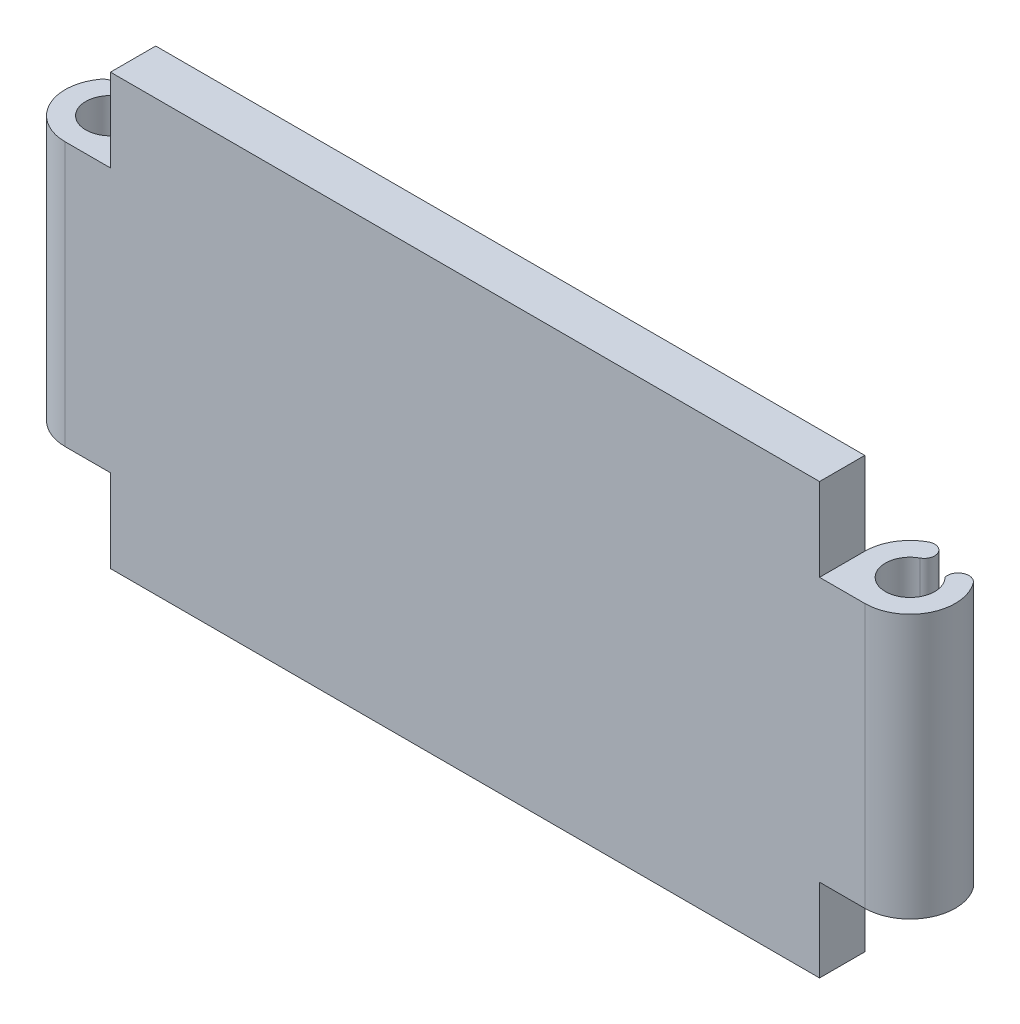
ISO-10303-21;
HEADER;
FILE_DESCRIPTION(('STEP AP214'),'2;1');
FILE_NAME('part.step','',(''),(''),'','','');
FILE_SCHEMA(('AUTOMOTIVE_DESIGN { 1 0 10303 214 1 1 1 1 }'));
ENDSEC;
DATA;
#1=APPLICATION_CONTEXT('core data for automotive mechanical design processes');
#2=APPLICATION_PROTOCOL_DEFINITION('international standard','automotive_design',2000,#1);
#3=PRODUCT_CONTEXT('',#1,'mechanical');
#4=PRODUCT('Part','Part','',(#3));
#5=PRODUCT_RELATED_PRODUCT_CATEGORY('part','',(#4));
#6=PRODUCT_DEFINITION_FORMATION('','',#4);
#7=PRODUCT_DEFINITION_CONTEXT('part definition',#1,'design');
#8=PRODUCT_DEFINITION('design','',#6,#7);
#9=PRODUCT_DEFINITION_SHAPE('','',#8);
#10=(LENGTH_UNIT() NAMED_UNIT(*) SI_UNIT(.MILLI.,.METRE.));
#11=(NAMED_UNIT(*) PLANE_ANGLE_UNIT() SI_UNIT($,.RADIAN.));
#12=(NAMED_UNIT(*) SI_UNIT($,.STERADIAN.) SOLID_ANGLE_UNIT());
#13=UNCERTAINTY_MEASURE_WITH_UNIT(LENGTH_MEASURE(1.E-05),#10,'distance_accuracy_value','');
#14=(GEOMETRIC_REPRESENTATION_CONTEXT(3) GLOBAL_UNCERTAINTY_ASSIGNED_CONTEXT((#13)) GLOBAL_UNIT_ASSIGNED_CONTEXT((#10,
#11,#12)) REPRESENTATION_CONTEXT('',''));
#15=CARTESIAN_POINT('',(0.,0.,0.));
#16=DIRECTION('',(0.,0.,1.));
#17=DIRECTION('',(1.,0.,0.));
#18=AXIS2_PLACEMENT_3D('',#15,#16,#17);
#19=CARTESIAN_POINT('',(-56.696642552174,57.,-2.67008988531399));
#20=DIRECTION('',(0.,-1.,0.));
#21=DIRECTION('',(0.,0.,-1.));
#22=AXIS2_PLACEMENT_3D('',#19,#20,#21);
#23=CYLINDRICAL_SURFACE('',#22,1.43989625620208);
#24=CARTESIAN_POINT('',(-56.696642552174,11.,-2.67008988531399));
#25=DIRECTION('',(0.,-1.,0.));
#26=DIRECTION('',(0.,0.,-1.));
#27=AXIS2_PLACEMENT_3D('',#24,#25,#26);
#28=CIRCLE('',#27,1.43989625620208);
#29=CARTESIAN_POINT('',(-57.8638927005138,11.,-3.51319623674638));
#30=VERTEX_POINT('',#29);
#31=CARTESIAN_POINT('',(-55.2962462943004,11.,-2.33513981506707));
#32=VERTEX_POINT('',#31);
#33=EDGE_CURVE('E257',#30,#32,#28,.T.);
#34=ORIENTED_EDGE('',*,*,#33,.F.);
#35=DIRECTION('',(0.,-1.,0.));
#36=VECTOR('',#35,1.);
#37=CARTESIAN_POINT('',(-57.8638927005138,57.,-3.51319623674638));
#38=LINE('',#37,#36);
#39=CARTESIAN_POINT('',(-57.8638927005138,46.,-3.51319623674638));
#40=VERTEX_POINT('',#39);
#41=EDGE_CURVE('E47',#40,#30,#38,.T.);
#42=ORIENTED_EDGE('',*,*,#41,.F.);
#43=CARTESIAN_POINT('',(-56.696642552174,46.,-2.67008988531399));
#44=DIRECTION('',(0.,1.,0.));
#45=DIRECTION('',(0.,0.,1.));
#46=AXIS2_PLACEMENT_3D('',#43,#44,#45);
#47=CIRCLE('',#46,1.43989625620208);
#48=CARTESIAN_POINT('',(-55.2962462943004,46.,-2.33513981506707));
#49=VERTEX_POINT('',#48);
#50=EDGE_CURVE('E255',#49,#40,#47,.T.);
#51=ORIENTED_EDGE('',*,*,#50,.F.);
#52=DIRECTION('',(0.,-1.,0.));
#53=VECTOR('',#52,1.);
#54=CARTESIAN_POINT('',(-55.2962462943004,57.,-2.33513981506707));
#55=LINE('',#54,#53);
#56=EDGE_CURVE('E258',#49,#32,#55,.T.);
#57=ORIENTED_EDGE('',*,*,#56,.T.);
#58=EDGE_LOOP('',(#34,#42,#51,#57));
#59=FACE_BOUND('',#58,.T.);
#60=ADVANCED_FACE('F39',(#59),#23,.T.);
#61=CARTESIAN_POINT('',(-53.,57.,0.));
#62=DIRECTION('',(0.,-1.,0.));
#63=DIRECTION('',(0.,0.,-1.));
#64=AXIS2_PLACEMENT_3D('',#61,#62,#63);
#65=CYLINDRICAL_SURFACE('',#64,6.);
#66=CARTESIAN_POINT('',(-53.,11.,0.));
#67=DIRECTION('',(0.,-1.,0.));
#68=DIRECTION('',(0.,0.,-1.));
#69=AXIS2_PLACEMENT_3D('',#66,#67,#68);
#70=CIRCLE('',#69,6.);
#71=CARTESIAN_POINT('',(-53.,11.,5.99999999999999));
#72=VERTEX_POINT('',#71);
#73=EDGE_CURVE('E177',#72,#30,#70,.T.);
#74=ORIENTED_EDGE('',*,*,#73,.F.);
#75=DIRECTION('',(0.,-1.,0.));
#76=VECTOR('',#75,1.);
#77=CARTESIAN_POINT('',(-53.,57.,6.));
#78=LINE('',#77,#76);
#79=CARTESIAN_POINT('',(-53.,46.,5.99999999999999));
#80=VERTEX_POINT('',#79);
#81=EDGE_CURVE('E239',#80,#72,#78,.T.);
#82=ORIENTED_EDGE('',*,*,#81,.F.);
#83=CARTESIAN_POINT('',(-53.,46.,0.));
#84=DIRECTION('',(0.,1.,0.));
#85=DIRECTION('',(0.,0.,1.));
#86=AXIS2_PLACEMENT_3D('',#83,#84,#85);
#87=CIRCLE('',#86,6.);
#88=EDGE_CURVE('E250',#40,#80,#87,.T.);
#89=ORIENTED_EDGE('',*,*,#88,.F.);
#90=ORIENTED_EDGE('',*,*,#41,.T.);
#91=EDGE_LOOP('',(#74,#82,#89,#90));
#92=FACE_BOUND('',#91,.T.);
#93=ADVANCED_FACE('F248',(#92),#65,.T.);
#94=CARTESIAN_POINT('',(53.,57.,0.));
#95=DIRECTION('',(0.,-1.,0.));
#96=DIRECTION('',(0.,0.,-1.));
#97=AXIS2_PLACEMENT_3D('',#94,#95,#96);
#98=CYLINDRICAL_SURFACE('',#97,6.);
#99=CARTESIAN_POINT('',(53.,11.,0.));
#100=DIRECTION('',(0.,-1.,0.));
#101=DIRECTION('',(0.,0.,-1.));
#102=AXIS2_PLACEMENT_3D('',#99,#100,#101);
#103=CIRCLE('',#102,6.);
#104=CARTESIAN_POINT('',(57.8638927005138,11.,-3.51319623674639));
#105=VERTEX_POINT('',#104);
#106=CARTESIAN_POINT('',(53.,11.,5.99999999999999));
#107=VERTEX_POINT('',#106);
#108=EDGE_CURVE('E367',#105,#107,#103,.T.);
#109=ORIENTED_EDGE('',*,*,#108,.F.);
#110=DIRECTION('',(0.,-1.,0.));
#111=VECTOR('',#110,1.);
#112=CARTESIAN_POINT('',(57.8638927005138,57.,-3.5131962367464));
#113=LINE('',#112,#111);
#114=CARTESIAN_POINT('',(57.8638927005138,46.,-3.51319623674639));
#115=VERTEX_POINT('',#114);
#116=EDGE_CURVE('E231',#115,#105,#113,.T.);
#117=ORIENTED_EDGE('',*,*,#116,.F.);
#118=CARTESIAN_POINT('',(53.,46.,0.));
#119=DIRECTION('',(0.,1.,0.));
#120=DIRECTION('',(0.,0.,1.));
#121=AXIS2_PLACEMENT_3D('',#118,#119,#120);
#122=CIRCLE('',#121,6.);
#123=CARTESIAN_POINT('',(53.,46.,5.99999999999999));
#124=VERTEX_POINT('',#123);
#125=EDGE_CURVE('E287',#124,#115,#122,.T.);
#126=ORIENTED_EDGE('',*,*,#125,.F.);
#127=DIRECTION('',(0.,-1.,0.));
#128=VECTOR('',#127,1.);
#129=CARTESIAN_POINT('',(53.,57.,5.99999999999999));
#130=LINE('',#129,#128);
#131=EDGE_CURVE('E235',#124,#107,#130,.T.);
#132=ORIENTED_EDGE('',*,*,#131,.T.);
#133=EDGE_LOOP('',(#109,#117,#126,#132));
#134=FACE_BOUND('',#133,.T.);
#135=ADVANCED_FACE('F410',(#134),#98,.T.);
#136=CARTESIAN_POINT('',(56.696642552174,57.,-2.670089885314));
#137=DIRECTION('',(0.,-1.,0.));
#138=DIRECTION('',(0.,0.,-1.));
#139=AXIS2_PLACEMENT_3D('',#136,#137,#138);
#140=CYLINDRICAL_SURFACE('',#139,1.43989625620208);
#141=CARTESIAN_POINT('',(56.696642552174,11.,-2.670089885314));
#142=DIRECTION('',(0.,-1.,0.));
#143=DIRECTION('',(0.,0.,-1.));
#144=AXIS2_PLACEMENT_3D('',#141,#142,#143);
#145=CIRCLE('',#144,1.43989625620208);
#146=CARTESIAN_POINT('',(55.2962462943004,11.,-2.33513981506708));
#147=VERTEX_POINT('',#146);
#148=EDGE_CURVE('E391',#147,#105,#145,.T.);
#149=ORIENTED_EDGE('',*,*,#148,.F.);
#150=DIRECTION('',(0.,-1.,0.));
#151=VECTOR('',#150,1.);
#152=CARTESIAN_POINT('',(55.2962462943004,57.,-2.33513981506708));
#153=LINE('',#152,#151);
#154=CARTESIAN_POINT('',(55.2962462943004,46.,-2.33513981506708));
#155=VERTEX_POINT('',#154);
#156=EDGE_CURVE('E227',#155,#147,#153,.T.);
#157=ORIENTED_EDGE('',*,*,#156,.F.);
#158=CARTESIAN_POINT('',(56.696642552174,46.,-2.670089885314));
#159=DIRECTION('',(0.,1.,0.));
#160=DIRECTION('',(0.,0.,1.));
#161=AXIS2_PLACEMENT_3D('',#158,#159,#160);
#162=CIRCLE('',#161,1.43989625620208);
#163=EDGE_CURVE('E310',#115,#155,#162,.T.);
#164=ORIENTED_EDGE('',*,*,#163,.F.);
#165=ORIENTED_EDGE('',*,*,#116,.T.);
#166=EDGE_LOOP('',(#149,#157,#164,#165));
#167=FACE_BOUND('',#166,.T.);
#168=ADVANCED_FACE('F418',(#167),#140,.T.);
#169=CARTESIAN_POINT('',(53.,57.,0.));
#170=DIRECTION('',(0.,-1.,0.));
#171=DIRECTION('',(0.,0.,-1.));
#172=AXIS2_PLACEMENT_3D('',#169,#170,#171);
#173=CYLINDRICAL_SURFACE('',#172,3.275);
#174=CARTESIAN_POINT('',(53.,11.,0.));
#175=DIRECTION('',(0.,-1.,0.));
#176=DIRECTION('',(0.,0.,-1.));
#177=AXIS2_PLACEMENT_3D('',#174,#175,#176);
#178=CIRCLE('',#177,3.275);
#179=CARTESIAN_POINT('',(51.4495535986174,11.,-2.88474278861042));
#180=VERTEX_POINT('',#179);
#181=EDGE_CURVE('E388',#180,#147,#178,.F.);
#182=ORIENTED_EDGE('',*,*,#181,.F.);
#183=DIRECTION('',(0.,-1.,0.));
#184=VECTOR('',#183,1.);
#185=CARTESIAN_POINT('',(51.4495535986174,57.,-2.88474278861042));
#186=LINE('',#185,#184);
#187=CARTESIAN_POINT('',(51.4495535986174,46.,-2.88474278861042));
#188=VERTEX_POINT('',#187);
#189=EDGE_CURVE('E223',#188,#180,#186,.T.);
#190=ORIENTED_EDGE('',*,*,#189,.F.);
#191=CARTESIAN_POINT('',(53.,46.,0.));
#192=DIRECTION('',(0.,1.,0.));
#193=DIRECTION('',(0.,0.,1.));
#194=AXIS2_PLACEMENT_3D('',#191,#192,#193);
#195=CIRCLE('',#194,3.275);
#196=EDGE_CURVE('E307',#155,#188,#195,.F.);
#197=ORIENTED_EDGE('',*,*,#196,.F.);
#198=ORIENTED_EDGE('',*,*,#156,.T.);
#199=EDGE_LOOP('',(#182,#190,#197,#198));
#200=FACE_BOUND('',#199,.T.);
#201=ADVANCED_FACE('F421',(#200),#173,.F.);
#202=CARTESIAN_POINT('',(50.8045205537674,57.,-4.08488387242161));
#203=DIRECTION('',(0.,-1.,0.));
#204=DIRECTION('',(0.,0.,-1.));
#205=AXIS2_PLACEMENT_3D('',#202,#203,#204);
#206=CYLINDRICAL_SURFACE('',#205,1.3625);
#207=CARTESIAN_POINT('',(50.8045205537674,11.,-4.08488387242161));
#208=DIRECTION('',(0.,-1.,0.));
#209=DIRECTION('',(0.,0.,-1.));
#210=AXIS2_PLACEMENT_3D('',#207,#208,#209);
#211=CIRCLE('',#210,1.3625);
#212=CARTESIAN_POINT('',(50.1594875089174,11.,-5.28502495623282));
#213=VERTEX_POINT('',#212);
#214=EDGE_CURVE('E385',#213,#180,#211,.T.);
#215=ORIENTED_EDGE('',*,*,#214,.F.);
#216=DIRECTION('',(0.,-1.,0.));
#217=VECTOR('',#216,1.);
#218=CARTESIAN_POINT('',(50.1594875089174,57.,-5.28502495623282));
#219=LINE('',#218,#217);
#220=CARTESIAN_POINT('',(50.1594875089174,46.,-5.28502495623282));
#221=VERTEX_POINT('',#220);
#222=EDGE_CURVE('E219',#221,#213,#219,.T.);
#223=ORIENTED_EDGE('',*,*,#222,.F.);
#224=CARTESIAN_POINT('',(50.8045205537674,46.,-4.08488387242161));
#225=DIRECTION('',(0.,1.,0.));
#226=DIRECTION('',(0.,0.,1.));
#227=AXIS2_PLACEMENT_3D('',#224,#225,#226);
#228=CIRCLE('',#227,1.3625);
#229=EDGE_CURVE('E304',#188,#221,#228,.T.);
#230=ORIENTED_EDGE('',*,*,#229,.F.);
#231=ORIENTED_EDGE('',*,*,#189,.T.);
#232=EDGE_LOOP('',(#215,#223,#230,#231));
#233=FACE_BOUND('',#232,.T.);
#234=ADVANCED_FACE('F425',(#233),#206,.T.);
#235=CARTESIAN_POINT('',(53.,57.,0.));
#236=DIRECTION('',(0.,-1.,0.));
#237=DIRECTION('',(0.,0.,-1.));
#238=AXIS2_PLACEMENT_3D('',#235,#236,#237);
#239=CYLINDRICAL_SURFACE('',#238,6.);
#240=CARTESIAN_POINT('',(47.,11.,0.));
#241=VERTEX_POINT('',#240);
#242=EDGE_CURVE('E360',#241,#213,#103,.T.);
#243=ORIENTED_EDGE('',*,*,#242,.F.);
#244=DIRECTION('',(0.,-1.,0.));
#245=VECTOR('',#244,1.);
#246=CARTESIAN_POINT('',(47.,57.,0.));
#247=LINE('',#246,#245);
#248=CARTESIAN_POINT('',(47.,46.,0.));
#249=VERTEX_POINT('',#248);
#250=EDGE_CURVE('E210',#249,#241,#247,.T.);
#251=ORIENTED_EDGE('',*,*,#250,.F.);
#252=EDGE_CURVE('E265',#221,#249,#122,.T.);
#253=ORIENTED_EDGE('',*,*,#252,.F.);
#254=ORIENTED_EDGE('',*,*,#222,.T.);
#255=EDGE_LOOP('',(#243,#251,#253,#254));
#256=FACE_BOUND('',#255,.T.);
#257=ADVANCED_FACE('F358',(#256),#239,.T.);
#258=CARTESIAN_POINT('',(-53.,57.,0.));
#259=DIRECTION('',(0.,-1.,0.));
#260=DIRECTION('',(0.,0.,-1.));
#261=AXIS2_PLACEMENT_3D('',#258,#259,#260);
#262=CYLINDRICAL_SURFACE('',#261,6.);
#263=CARTESIAN_POINT('',(-50.1594875089174,11.,-5.2850249562328));
#264=VERTEX_POINT('',#263);
#265=CARTESIAN_POINT('',(-47.,11.,0.));
#266=VERTEX_POINT('',#265);
#267=EDGE_CURVE('E165',#264,#266,#70,.T.);
#268=ORIENTED_EDGE('',*,*,#267,.F.);
#269=DIRECTION('',(0.,-1.,0.));
#270=VECTOR('',#269,1.);
#271=CARTESIAN_POINT('',(-50.1594875089174,57.,-5.2850249562328));
#272=LINE('',#271,#270);
#273=CARTESIAN_POINT('',(-50.1594875089174,46.,-5.2850249562328));
#274=VERTEX_POINT('',#273);
#275=EDGE_CURVE('E206',#274,#264,#272,.T.);
#276=ORIENTED_EDGE('',*,*,#275,.F.);
#277=CARTESIAN_POINT('',(-47.,46.,0.));
#278=VERTEX_POINT('',#277);
#279=EDGE_CURVE('E203',#278,#274,#87,.T.);
#280=ORIENTED_EDGE('',*,*,#279,.F.);
#281=DIRECTION('',(0.,-1.,0.));
#282=VECTOR('',#281,1.);
#283=CARTESIAN_POINT('',(-47.,57.,0.));
#284=LINE('',#283,#282);
#285=EDGE_CURVE('E195',#278,#266,#284,.T.);
#286=ORIENTED_EDGE('',*,*,#285,.T.);
#287=EDGE_LOOP('',(#268,#276,#280,#286));
#288=FACE_BOUND('',#287,.T.);
#289=ADVANCED_FACE('F202',(#288),#262,.T.);
#290=CARTESIAN_POINT('',(-50.8045205537674,57.,-4.0848838724216));
#291=DIRECTION('',(0.,-1.,0.));
#292=DIRECTION('',(0.,0.,-1.));
#293=AXIS2_PLACEMENT_3D('',#290,#291,#292);
#294=CYLINDRICAL_SURFACE('',#293,1.3625);
#295=CARTESIAN_POINT('',(-50.8045205537674,11.,-4.0848838724216));
#296=DIRECTION('',(0.,-1.,0.));
#297=DIRECTION('',(0.,0.,-1.));
#298=AXIS2_PLACEMENT_3D('',#295,#296,#297);
#299=CIRCLE('',#298,1.3625);
#300=CARTESIAN_POINT('',(-51.4495535986174,11.,-2.8847427886104));
#301=VERTEX_POINT('',#300);
#302=EDGE_CURVE('E171',#301,#264,#299,.T.);
#303=ORIENTED_EDGE('',*,*,#302,.F.);
#304=DIRECTION('',(0.,-1.,0.));
#305=VECTOR('',#304,1.);
#306=CARTESIAN_POINT('',(-51.4495535986174,57.,-2.8847427886104));
#307=LINE('',#306,#305);
#308=CARTESIAN_POINT('',(-51.4495535986174,46.,-2.8847427886104));
#309=VERTEX_POINT('',#308);
#310=EDGE_CURVE('E211',#309,#301,#307,.T.);
#311=ORIENTED_EDGE('',*,*,#310,.F.);
#312=CARTESIAN_POINT('',(-50.8045205537674,46.,-4.0848838724216));
#313=DIRECTION('',(0.,1.,0.));
#314=DIRECTION('',(0.,0.,1.));
#315=AXIS2_PLACEMENT_3D('',#312,#313,#314);
#316=CIRCLE('',#315,1.3625);
#317=EDGE_CURVE('E286',#274,#309,#316,.T.);
#318=ORIENTED_EDGE('',*,*,#317,.F.);
#319=ORIENTED_EDGE('',*,*,#275,.T.);
#320=EDGE_LOOP('',(#303,#311,#318,#319));
#321=FACE_BOUND('',#320,.T.);
#322=ADVANCED_FACE('F336',(#321),#294,.T.);
#323=CARTESIAN_POINT('',(-53.,57.,0.));
#324=DIRECTION('',(0.,-1.,0.));
#325=DIRECTION('',(0.,0.,-1.));
#326=AXIS2_PLACEMENT_3D('',#323,#324,#325);
#327=CYLINDRICAL_SURFACE('',#326,3.275);
#328=CARTESIAN_POINT('',(-53.,11.,0.));
#329=DIRECTION('',(0.,-1.,0.));
#330=DIRECTION('',(0.,0.,-1.));
#331=AXIS2_PLACEMENT_3D('',#328,#329,#330);
#332=CIRCLE('',#331,3.275);
#333=EDGE_CURVE('E267',#32,#301,#332,.F.);
#334=ORIENTED_EDGE('',*,*,#333,.F.);
#335=ORIENTED_EDGE('',*,*,#56,.F.);
#336=CARTESIAN_POINT('',(-53.,46.,0.));
#337=DIRECTION('',(0.,1.,0.));
#338=DIRECTION('',(0.,0.,1.));
#339=AXIS2_PLACEMENT_3D('',#336,#337,#338);
#340=CIRCLE('',#339,3.275);
#341=EDGE_CURVE('E11',#309,#49,#340,.F.);
#342=ORIENTED_EDGE('',*,*,#341,.F.);
#343=ORIENTED_EDGE('',*,*,#310,.T.);
#344=EDGE_LOOP('',(#334,#335,#342,#343));
#345=FACE_BOUND('',#344,.T.);
#346=ADVANCED_FACE('F333',(#345),#327,.F.);
#347=CARTESIAN_POINT('',(53.,57.,5.99999999999999));
#348=DIRECTION('',(0.,0.,-1.));
#349=DIRECTION('',(-1.,0.,0.));
#350=AXIS2_PLACEMENT_3D('',#347,#348,#349);
#351=PLANE('',#350);
#352=DIRECTION('',(-1.,0.,0.));
#353=VECTOR('',#352,1.);
#354=CARTESIAN_POINT('',(-53.,11.,5.99999999999999));
#355=LINE('',#354,#353);
#356=CARTESIAN_POINT('',(-47.,11.,6.));
#357=VERTEX_POINT('',#356);
#358=EDGE_CURVE('E188',#357,#72,#355,.T.);
#359=ORIENTED_EDGE('',*,*,#358,.F.);
#360=DIRECTION('',(0.,-1.,0.));
#361=VECTOR('',#360,1.);
#362=CARTESIAN_POINT('',(-47.,11.,6.));
#363=LINE('',#362,#361);
#364=CARTESIAN_POINT('',(-47.,0.,6.));
#365=VERTEX_POINT('',#364);
#366=EDGE_CURVE('E186',#357,#365,#363,.T.);
#367=ORIENTED_EDGE('',*,*,#366,.T.);
#368=DIRECTION('',(1.,0.,0.));
#369=VECTOR('',#368,1.);
#370=CARTESIAN_POINT('',(53.,0.,5.99999999999999));
#371=LINE('',#370,#369);
#372=CARTESIAN_POINT('',(47.,0.,5.99999999999999));
#373=VERTEX_POINT('',#372);
#374=EDGE_CURVE('E313',#365,#373,#371,.T.);
#375=ORIENTED_EDGE('',*,*,#374,.T.);
#376=DIRECTION('',(0.,-1.,0.));
#377=VECTOR('',#376,1.);
#378=CARTESIAN_POINT('',(47.,11.,5.99999999999999));
#379=LINE('',#378,#377);
#380=CARTESIAN_POINT('',(47.,11.,5.99999999999999));
#381=VERTEX_POINT('',#380);
#382=EDGE_CURVE('E54',#381,#373,#379,.T.);
#383=ORIENTED_EDGE('',*,*,#382,.F.);
#384=DIRECTION('',(-1.,0.,0.));
#385=VECTOR('',#384,1.);
#386=CARTESIAN_POINT('',(47.,11.,5.99999999999999));
#387=LINE('',#386,#385);
#388=EDGE_CURVE('E366',#107,#381,#387,.T.);
#389=ORIENTED_EDGE('',*,*,#388,.F.);
#390=ORIENTED_EDGE('',*,*,#131,.F.);
#391=DIRECTION('',(1.,0.,0.));
#392=VECTOR('',#391,1.);
#393=CARTESIAN_POINT('',(53.,46.,5.99999999999999));
#394=LINE('',#393,#392);
#395=CARTESIAN_POINT('',(47.,46.,5.99999999999999));
#396=VERTEX_POINT('',#395);
#397=EDGE_CURVE('E294',#396,#124,#394,.T.);
#398=ORIENTED_EDGE('',*,*,#397,.F.);
#399=DIRECTION('',(0.,1.,0.));
#400=VECTOR('',#399,1.);
#401=CARTESIAN_POINT('',(47.,46.,5.99999999999999));
#402=LINE('',#401,#400);
#403=CARTESIAN_POINT('',(47.,57.,5.99999999999999));
#404=VERTEX_POINT('',#403);
#405=EDGE_CURVE('E283',#396,#404,#402,.T.);
#406=ORIENTED_EDGE('',*,*,#405,.T.);
#407=DIRECTION('',(1.,0.,0.));
#408=VECTOR('',#407,1.);
#409=CARTESIAN_POINT('',(53.,57.,5.99999999999999));
#410=LINE('',#409,#408);
#411=CARTESIAN_POINT('',(-47.,57.,6.));
#412=VERTEX_POINT('',#411);
#413=EDGE_CURVE('E314',#412,#404,#410,.T.);
#414=ORIENTED_EDGE('',*,*,#413,.F.);
#415=DIRECTION('',(0.,1.,0.));
#416=VECTOR('',#415,1.);
#417=CARTESIAN_POINT('',(-47.,46.,6.));
#418=LINE('',#417,#416);
#419=CARTESIAN_POINT('',(-47.,46.,6.));
#420=VERTEX_POINT('',#419);
#421=EDGE_CURVE('E62',#420,#412,#418,.T.);
#422=ORIENTED_EDGE('',*,*,#421,.F.);
#423=DIRECTION('',(1.,0.,0.));
#424=VECTOR('',#423,1.);
#425=CARTESIAN_POINT('',(-47.,46.,6.));
#426=LINE('',#425,#424);
#427=EDGE_CURVE('E273',#80,#420,#426,.T.);
#428=ORIENTED_EDGE('',*,*,#427,.F.);
#429=ORIENTED_EDGE('',*,*,#81,.T.);
#430=EDGE_LOOP('',(#359,#367,#375,#383,#389,#390,#398,#406,#414,#422,#428,#429));
#431=FACE_BOUND('',#430,.T.);
#432=ADVANCED_FACE('F343',(#431),#351,.F.);
#433=CARTESIAN_POINT('',(-47.,57.,0.));
#434=DIRECTION('',(0.,0.,1.));
#435=DIRECTION('',(1.,0.,0.));
#436=AXIS2_PLACEMENT_3D('',#433,#434,#435);
#437=PLANE('',#436);
#438=DIRECTION('',(-1.,0.,0.));
#439=VECTOR('',#438,1.);
#440=CARTESIAN_POINT('',(-47.,0.,0.));
#441=LINE('',#440,#439);
#442=CARTESIAN_POINT('',(47.,0.,0.));
#443=VERTEX_POINT('',#442);
#444=CARTESIAN_POINT('',(-47.,0.,0.));
#445=VERTEX_POINT('',#444);
#446=EDGE_CURVE('E198',#443,#445,#441,.T.);
#447=ORIENTED_EDGE('',*,*,#446,.T.);
#448=DIRECTION('',(0.,-1.,0.));
#449=VECTOR('',#448,1.);
#450=CARTESIAN_POINT('',(-47.,11.,0.));
#451=LINE('',#450,#449);
#452=EDGE_CURVE('E183',#266,#445,#451,.T.);
#453=ORIENTED_EDGE('',*,*,#452,.F.);
#454=ORIENTED_EDGE('',*,*,#285,.F.);
#455=CARTESIAN_POINT('',(-47.,57.,0.));
#456=VERTEX_POINT('',#455);
#457=EDGE_CURVE('E205',#456,#278,#284,.T.);
#458=ORIENTED_EDGE('',*,*,#457,.F.);
#459=DIRECTION('',(-1.,0.,0.));
#460=VECTOR('',#459,1.);
#461=CARTESIAN_POINT('',(-47.,57.,0.));
#462=LINE('',#461,#460);
#463=CARTESIAN_POINT('',(47.,57.,0.));
#464=VERTEX_POINT('',#463);
#465=EDGE_CURVE('E318',#464,#456,#462,.T.);
#466=ORIENTED_EDGE('',*,*,#465,.F.);
#467=EDGE_CURVE('E215',#464,#249,#247,.T.);
#468=ORIENTED_EDGE('',*,*,#467,.T.);
#469=ORIENTED_EDGE('',*,*,#250,.T.);
#470=DIRECTION('',(0.,-1.,0.));
#471=VECTOR('',#470,1.);
#472=CARTESIAN_POINT('',(47.,11.,0.));
#473=LINE('',#472,#471);
#474=EDGE_CURVE('E380',#241,#443,#473,.T.);
#475=ORIENTED_EDGE('',*,*,#474,.T.);
#476=EDGE_LOOP('',(#447,#453,#454,#458,#466,#468,#469,#475));
#477=FACE_BOUND('',#476,.T.);
#478=ADVANCED_FACE('F193',(#477),#437,.F.);
#479=CARTESIAN_POINT('',(-56.696642552174,57.,-2.67008988531399));
#480=DIRECTION('',(0.,1.,0.));
#481=DIRECTION('',(0.,0.,1.));
#482=AXIS2_PLACEMENT_3D('',#479,#480,#481);
#483=PLANE('',#482);
#484=DIRECTION('',(0.,0.,-1.));
#485=VECTOR('',#484,1.);
#486=CARTESIAN_POINT('',(-47.,57.,0.));
#487=LINE('',#486,#485);
#488=EDGE_CURVE('E280',#412,#456,#487,.T.);
#489=ORIENTED_EDGE('',*,*,#488,.F.);
#490=ORIENTED_EDGE('',*,*,#413,.T.);
#491=DIRECTION('',(0.,0.,1.));
#492=VECTOR('',#491,1.);
#493=CARTESIAN_POINT('',(47.,57.,0.));
#494=LINE('',#493,#492);
#495=EDGE_CURVE('E261',#464,#404,#494,.T.);
#496=ORIENTED_EDGE('',*,*,#495,.F.);
#497=ORIENTED_EDGE('',*,*,#465,.T.);
#498=EDGE_LOOP('',(#489,#490,#496,#497));
#499=FACE_BOUND('',#498,.T.);
#500=ADVANCED_FACE('F347',(#499),#483,.T.);
#501=CARTESIAN_POINT('',(-56.696642552174,0.,-2.67008988531399));
#502=DIRECTION('',(0.,1.,0.));
#503=DIRECTION('',(0.,0.,1.));
#504=AXIS2_PLACEMENT_3D('',#501,#502,#503);
#505=PLANE('',#504);
#506=ORIENTED_EDGE('',*,*,#374,.F.);
#507=DIRECTION('',(0.,0.,1.));
#508=VECTOR('',#507,1.);
#509=CARTESIAN_POINT('',(-47.,0.,0.));
#510=LINE('',#509,#508);
#511=EDGE_CURVE('E178',#445,#365,#510,.T.);
#512=ORIENTED_EDGE('',*,*,#511,.F.);
#513=ORIENTED_EDGE('',*,*,#446,.F.);
#514=DIRECTION('',(0.,0.,-1.));
#515=VECTOR('',#514,1.);
#516=CARTESIAN_POINT('',(47.,0.,0.));
#517=LINE('',#516,#515);
#518=EDGE_CURVE('E373',#373,#443,#517,.T.);
#519=ORIENTED_EDGE('',*,*,#518,.F.);
#520=EDGE_LOOP('',(#506,#512,#513,#519));
#521=FACE_BOUND('',#520,.T.);
#522=ADVANCED_FACE('F402',(#521),#505,.F.);
#523=CARTESIAN_POINT('',(53.,46.,0.));
#524=DIRECTION('',(0.,1.,0.));
#525=DIRECTION('',(0.,0.,1.));
#526=AXIS2_PLACEMENT_3D('',#523,#524,#525);
#527=PLANE('',#526);
#528=ORIENTED_EDGE('',*,*,#163,.T.);
#529=ORIENTED_EDGE('',*,*,#196,.T.);
#530=ORIENTED_EDGE('',*,*,#229,.T.);
#531=ORIENTED_EDGE('',*,*,#252,.T.);
#532=DIRECTION('',(0.,0.,1.));
#533=VECTOR('',#532,1.);
#534=CARTESIAN_POINT('',(47.,46.,0.));
#535=LINE('',#534,#533);
#536=EDGE_CURVE('E290',#249,#396,#535,.T.);
#537=ORIENTED_EDGE('',*,*,#536,.T.);
#538=ORIENTED_EDGE('',*,*,#397,.T.);
#539=ORIENTED_EDGE('',*,*,#125,.T.);
#540=EDGE_LOOP('',(#528,#529,#530,#531,#537,#538,#539));
#541=FACE_BOUND('',#540,.T.);
#542=ADVANCED_FACE('F413',(#541),#527,.T.);
#543=CARTESIAN_POINT('',(47.,46.,0.));
#544=DIRECTION('',(-1.,0.,0.));
#545=DIRECTION('',(0.,0.,1.));
#546=AXIS2_PLACEMENT_3D('',#543,#544,#545);
#547=PLANE('',#546);
#548=ORIENTED_EDGE('',*,*,#495,.T.);
#549=ORIENTED_EDGE('',*,*,#405,.F.);
#550=ORIENTED_EDGE('',*,*,#536,.F.);
#551=ORIENTED_EDGE('',*,*,#467,.F.);
#552=EDGE_LOOP('',(#548,#549,#550,#551));
#553=FACE_BOUND('',#552,.T.);
#554=ADVANCED_FACE('F353',(#553),#547,.F.);
#555=CARTESIAN_POINT('',(-53.,46.,0.));
#556=DIRECTION('',(0.,1.,0.));
#557=DIRECTION('',(0.,0.,1.));
#558=AXIS2_PLACEMENT_3D('',#555,#556,#557);
#559=PLANE('',#558);
#560=ORIENTED_EDGE('',*,*,#50,.T.);
#561=ORIENTED_EDGE('',*,*,#88,.T.);
#562=ORIENTED_EDGE('',*,*,#427,.T.);
#563=DIRECTION('',(0.,0.,-1.));
#564=VECTOR('',#563,1.);
#565=CARTESIAN_POINT('',(-47.,46.,0.));
#566=LINE('',#565,#564);
#567=EDGE_CURVE('E276',#420,#278,#566,.T.);
#568=ORIENTED_EDGE('',*,*,#567,.T.);
#569=ORIENTED_EDGE('',*,*,#279,.T.);
#570=ORIENTED_EDGE('',*,*,#317,.T.);
#571=ORIENTED_EDGE('',*,*,#341,.T.);
#572=EDGE_LOOP('',(#560,#561,#562,#568,#569,#570,#571));
#573=FACE_BOUND('',#572,.T.);
#574=ADVANCED_FACE('F338',(#573),#559,.T.);
#575=CARTESIAN_POINT('',(-47.,46.,0.));
#576=DIRECTION('',(1.,0.,0.));
#577=DIRECTION('',(0.,0.,-1.));
#578=AXIS2_PLACEMENT_3D('',#575,#576,#577);
#579=PLANE('',#578);
#580=ORIENTED_EDGE('',*,*,#488,.T.);
#581=ORIENTED_EDGE('',*,*,#457,.T.);
#582=ORIENTED_EDGE('',*,*,#567,.F.);
#583=ORIENTED_EDGE('',*,*,#421,.T.);
#584=EDGE_LOOP('',(#580,#581,#582,#583));
#585=FACE_BOUND('',#584,.T.);
#586=ADVANCED_FACE('F340',(#585),#579,.F.);
#587=CARTESIAN_POINT('',(53.,11.,0.));
#588=DIRECTION('',(0.,-1.,0.));
#589=DIRECTION('',(0.,0.,-1.));
#590=AXIS2_PLACEMENT_3D('',#587,#588,#589);
#591=PLANE('',#590);
#592=ORIENTED_EDGE('',*,*,#148,.T.);
#593=ORIENTED_EDGE('',*,*,#108,.T.);
#594=ORIENTED_EDGE('',*,*,#388,.T.);
#595=DIRECTION('',(0.,0.,-1.));
#596=VECTOR('',#595,1.);
#597=CARTESIAN_POINT('',(47.,11.,0.));
#598=LINE('',#597,#596);
#599=EDGE_CURVE('E371',#381,#241,#598,.T.);
#600=ORIENTED_EDGE('',*,*,#599,.T.);
#601=ORIENTED_EDGE('',*,*,#242,.T.);
#602=ORIENTED_EDGE('',*,*,#214,.T.);
#603=ORIENTED_EDGE('',*,*,#181,.T.);
#604=EDGE_LOOP('',(#592,#593,#594,#600,#601,#602,#603));
#605=FACE_BOUND('',#604,.T.);
#606=ADVANCED_FACE('F404',(#605),#591,.T.);
#607=CARTESIAN_POINT('',(47.,11.,0.));
#608=DIRECTION('',(-1.,0.,0.));
#609=DIRECTION('',(0.,0.,1.));
#610=AXIS2_PLACEMENT_3D('',#607,#608,#609);
#611=PLANE('',#610);
#612=ORIENTED_EDGE('',*,*,#518,.T.);
#613=ORIENTED_EDGE('',*,*,#474,.F.);
#614=ORIENTED_EDGE('',*,*,#599,.F.);
#615=ORIENTED_EDGE('',*,*,#382,.T.);
#616=EDGE_LOOP('',(#612,#613,#614,#615));
#617=FACE_BOUND('',#616,.T.);
#618=ADVANCED_FACE('F403',(#617),#611,.F.);
#619=CARTESIAN_POINT('',(-53.,11.,0.));
#620=DIRECTION('',(0.,-1.,0.));
#621=DIRECTION('',(0.,0.,-1.));
#622=AXIS2_PLACEMENT_3D('',#619,#620,#621);
#623=PLANE('',#622);
#624=ORIENTED_EDGE('',*,*,#33,.T.);
#625=ORIENTED_EDGE('',*,*,#333,.T.);
#626=ORIENTED_EDGE('',*,*,#302,.T.);
#627=ORIENTED_EDGE('',*,*,#267,.T.);
#628=DIRECTION('',(0.,0.,1.));
#629=VECTOR('',#628,1.);
#630=CARTESIAN_POINT('',(-47.,11.,0.));
#631=LINE('',#630,#629);
#632=EDGE_CURVE('E168',#266,#357,#631,.T.);
#633=ORIENTED_EDGE('',*,*,#632,.T.);
#634=ORIENTED_EDGE('',*,*,#358,.T.);
#635=ORIENTED_EDGE('',*,*,#73,.T.);
#636=EDGE_LOOP('',(#624,#625,#626,#627,#633,#634,#635));
#637=FACE_BOUND('',#636,.T.);
#638=ADVANCED_FACE('F167',(#637),#623,.T.);
#639=CARTESIAN_POINT('',(-47.,11.,0.));
#640=DIRECTION('',(1.,0.,0.));
#641=DIRECTION('',(0.,0.,-1.));
#642=AXIS2_PLACEMENT_3D('',#639,#640,#641);
#643=PLANE('',#642);
#644=ORIENTED_EDGE('',*,*,#511,.T.);
#645=ORIENTED_EDGE('',*,*,#366,.F.);
#646=ORIENTED_EDGE('',*,*,#632,.F.);
#647=ORIENTED_EDGE('',*,*,#452,.T.);
#648=EDGE_LOOP('',(#644,#645,#646,#647));
#649=FACE_BOUND('',#648,.T.);
#650=ADVANCED_FACE('F182',(#649),#643,.F.);
#651=CLOSED_SHELL('',(#60,#93,#135,#168,#201,#234,#257,#289,#322,#346,#432,#478,#500,#522,#542,
#554,#574,#586,#606,#618,#638,#650));
#652=MANIFOLD_SOLID_BREP('B2',#651);
#653=ADVANCED_BREP_SHAPE_REPRESENTATION('',(#18,#652),#14);
#654=SHAPE_DEFINITION_REPRESENTATION(#9,#653);
ENDSEC;
END-ISO-10303-21;
